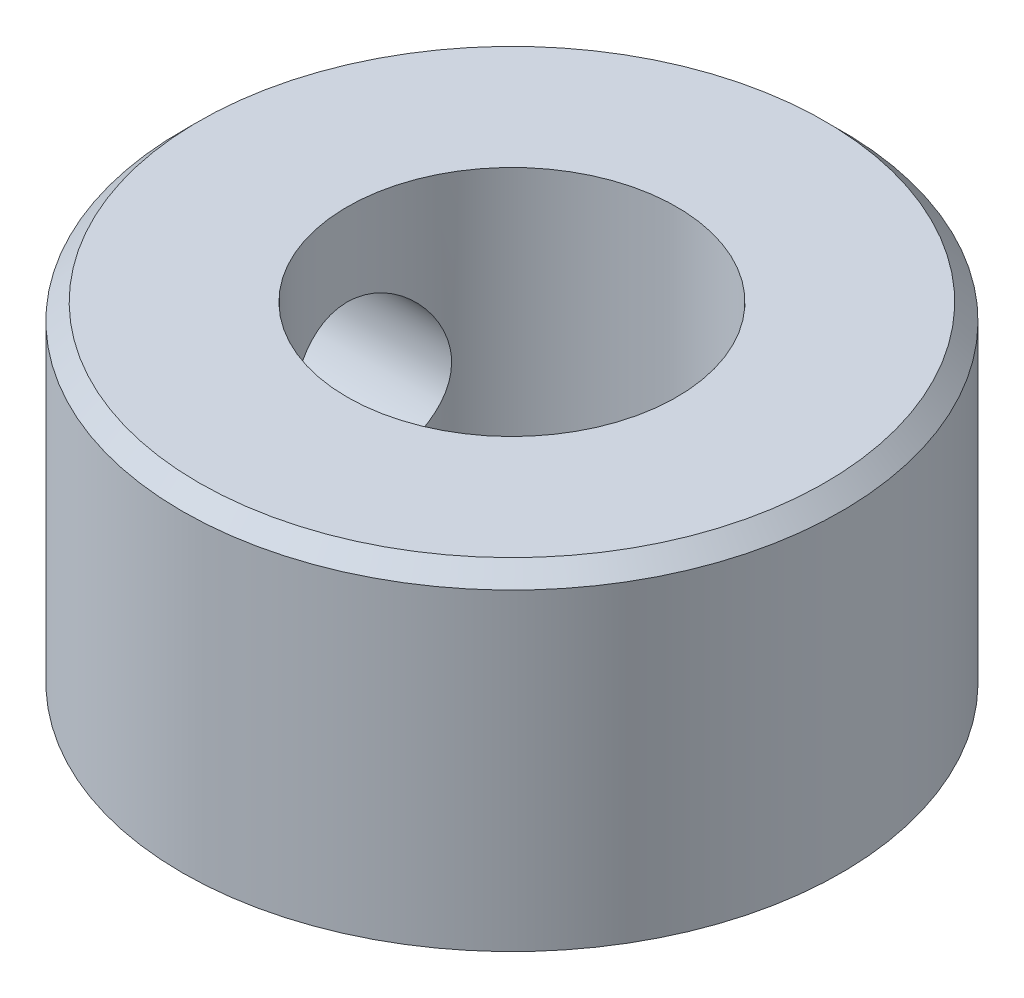
ISO-10303-21;
HEADER;
FILE_DESCRIPTION(('STEP AP214'),'2;1');
FILE_NAME('part.step','',(''),(''),'','','');
FILE_SCHEMA(('AUTOMOTIVE_DESIGN { 1 0 10303 214 1 1 1 1 }'));
ENDSEC;
DATA;
#1=APPLICATION_CONTEXT('core data for automotive mechanical design processes');
#2=APPLICATION_PROTOCOL_DEFINITION('international standard','automotive_design',2000,#1);
#3=PRODUCT_CONTEXT('',#1,'mechanical');
#4=PRODUCT('Part','Part','',(#3));
#5=PRODUCT_RELATED_PRODUCT_CATEGORY('part','',(#4));
#6=PRODUCT_DEFINITION_FORMATION('','',#4);
#7=PRODUCT_DEFINITION_CONTEXT('part definition',#1,'design');
#8=PRODUCT_DEFINITION('design','',#6,#7);
#9=PRODUCT_DEFINITION_SHAPE('','',#8);
#10=(LENGTH_UNIT() NAMED_UNIT(*) SI_UNIT(.MILLI.,.METRE.));
#11=(NAMED_UNIT(*) PLANE_ANGLE_UNIT() SI_UNIT($,.RADIAN.));
#12=(NAMED_UNIT(*) SI_UNIT($,.STERADIAN.) SOLID_ANGLE_UNIT());
#13=UNCERTAINTY_MEASURE_WITH_UNIT(LENGTH_MEASURE(1.E-05),#10,'distance_accuracy_value','');
#14=(GEOMETRIC_REPRESENTATION_CONTEXT(3) GLOBAL_UNCERTAINTY_ASSIGNED_CONTEXT((#13)) GLOBAL_UNIT_ASSIGNED_CONTEXT((#10,
#11,#12)) REPRESENTATION_CONTEXT('',''));
#15=CARTESIAN_POINT('',(0.,0.,0.));
#16=DIRECTION('',(0.,0.,1.));
#17=DIRECTION('',(1.,0.,0.));
#18=AXIS2_PLACEMENT_3D('',#15,#16,#17);
#19=CARTESIAN_POINT('',(0.,10.,0.));
#20=DIRECTION('',(0.,1.,0.));
#21=DIRECTION('',(0.,0.,1.));
#22=AXIS2_PLACEMENT_3D('',#19,#20,#21);
#23=PLANE('',#22);
#24=CARTESIAN_POINT('',(0.,10.,0.));
#25=DIRECTION('',(0.,1.,0.));
#26=DIRECTION('',(0.,0.,1.));
#27=AXIS2_PLACEMENT_3D('',#24,#25,#26);
#28=CIRCLE('',#27,9.49999999999999);
#29=CARTESIAN_POINT('',(0.,10.,9.49999999999999));
#30=VERTEX_POINT('',#29);
#31=EDGE_CURVE('E41',#30,#30,#28,.T.);
#32=ORIENTED_EDGE('',*,*,#31,.T.);
#33=EDGE_LOOP('',(#32));
#34=FACE_BOUND('',#33,.T.);
#35=CARTESIAN_POINT('',(0.,10.,0.));
#36=DIRECTION('',(0.,1.,0.));
#37=DIRECTION('',(0.,0.,1.));
#38=AXIS2_PLACEMENT_3D('',#35,#36,#37);
#39=CIRCLE('',#38,5.);
#40=CARTESIAN_POINT('',(0.,10.,5.));
#41=VERTEX_POINT('',#40);
#42=EDGE_CURVE('E49',#41,#41,#39,.T.);
#43=ORIENTED_EDGE('',*,*,#42,.F.);
#44=EDGE_LOOP('',(#43));
#45=FACE_BOUND('',#44,.T.);
#46=ADVANCED_FACE('F34',(#34,#45),#23,.T.);
#47=CARTESIAN_POINT('',(0.,0.,0.));
#48=DIRECTION('',(0.,1.,0.));
#49=DIRECTION('',(0.,0.,1.));
#50=AXIS2_PLACEMENT_3D('',#47,#48,#49);
#51=PLANE('',#50);
#52=CARTESIAN_POINT('',(0.,0.,0.));
#53=DIRECTION('',(0.,1.,0.));
#54=DIRECTION('',(0.,0.,1.));
#55=AXIS2_PLACEMENT_3D('',#52,#53,#54);
#56=CIRCLE('',#55,10.);
#57=CARTESIAN_POINT('',(0.,0.,10.));
#58=VERTEX_POINT('',#57);
#59=EDGE_CURVE('E45',#58,#58,#56,.T.);
#60=ORIENTED_EDGE('',*,*,#59,.F.);
#61=EDGE_LOOP('',(#60));
#62=FACE_BOUND('',#61,.T.);
#63=CARTESIAN_POINT('',(0.,0.,0.));
#64=DIRECTION('',(0.,1.,0.));
#65=DIRECTION('',(0.,0.,1.));
#66=AXIS2_PLACEMENT_3D('',#63,#64,#65);
#67=CIRCLE('',#66,5.);
#68=CARTESIAN_POINT('',(0.,0.,5.));
#69=VERTEX_POINT('',#68);
#70=EDGE_CURVE('E52',#69,#69,#67,.T.);
#71=ORIENTED_EDGE('',*,*,#70,.T.);
#72=EDGE_LOOP('',(#71));
#73=FACE_BOUND('',#72,.T.);
#74=ADVANCED_FACE('F85',(#62,#73),#51,.F.);
#75=CARTESIAN_POINT('',(0.,10.,0.));
#76=DIRECTION('',(0.,-1.,0.));
#77=DIRECTION('',(0.,0.,-1.));
#78=AXIS2_PLACEMENT_3D('',#75,#76,#77);
#79=CYLINDRICAL_SURFACE('',#78,10.);
#80=CARTESIAN_POINT('',(-9.68245836551854,5.,-2.5));
#81=CARTESIAN_POINT('',(-9.6824610008786,4.86194924907342,-2.49999607859307));
#82=CARTESIAN_POINT('',(-9.68544306014597,4.72385510132148,-2.48852624549765));
#83=CARTESIAN_POINT('',(-9.69701861992564,4.45163242182649,-2.44302312546379));
#84=CARTESIAN_POINT('',(-9.7056153862163,4.31750624553181,-2.40897670674211));
#85=CARTESIAN_POINT('',(-9.7273872459615,4.05719646181282,-2.31949119963204));
#86=CARTESIAN_POINT('',(-9.74055642690458,3.93100284461429,-2.26407972785449));
#87=CARTESIAN_POINT('',(-9.76998192028759,3.68968914746012,-2.13352114126138));
#88=CARTESIAN_POINT('',(-9.78623836378489,3.57456953791978,-2.05837318856068));
#89=CARTESIAN_POINT('',(-9.82040716355625,3.35613835473778,-1.88870842731188));
#90=CARTESIAN_POINT('',(-9.83834597623034,3.25310639964995,-1.79383688770405));
#91=CARTESIAN_POINT('',(-9.87362875515294,3.06423860563966,-1.58818206410066));
#92=CARTESIAN_POINT('',(-9.89097266566388,2.97840437437825,-1.47739729418031));
#93=CARTESIAN_POINT('',(-9.92340415520582,2.82522453236872,-1.24114520107895));
#94=CARTESIAN_POINT('',(-9.93845687400592,2.75815361183853,-1.11549457619512));
#95=CARTESIAN_POINT('',(-9.96430811925984,2.64619035584692,-0.854263184292761));
#96=CARTESIAN_POINT('',(-9.97510727334345,2.60129474808448,-0.718683885791939));
#97=CARTESIAN_POINT('',(-9.9910475884818,2.53585216542141,-0.44435875875416));
#98=CARTESIAN_POINT('',(-9.99629893844314,2.51483035567342,-0.305732719548974));
#99=CARTESIAN_POINT('',(-10.000935941073,2.49624162072445,-0.026828819262768));
#100=CARTESIAN_POINT('',(-10.000322460967,2.4986712277904,0.11344879453807));
#101=CARTESIAN_POINT('',(-9.99338094953534,2.52657485025014,0.388380617930969));
#102=CARTESIAN_POINT('',(-9.98718002340871,2.55153632505386,0.523090539002669));
#103=CARTESIAN_POINT('',(-9.96990836524857,2.6229712700485,0.786345618534217));
#104=CARTESIAN_POINT('',(-9.95883737398452,2.66944588537741,0.914890448426096));
#105=CARTESIAN_POINT('',(-9.93287509700884,2.78300257068706,1.16351675875452));
#106=CARTESIAN_POINT('',(-9.91795019695011,2.85026704466175,1.28351127441626));
#107=CARTESIAN_POINT('',(-9.88589903809692,3.00335567911626,1.51068905585122));
#108=CARTESIAN_POINT('',(-9.8687723965265,3.08918306856063,1.61787008771377));
#109=CARTESIAN_POINT('',(-9.83363713769356,3.27970874198237,1.81943508771239));
#110=CARTESIAN_POINT('',(-9.81561719525297,3.38485489234775,1.91339419768799));
#111=CARTESIAN_POINT('',(-9.78115043517327,3.60959997354028,2.08244093990755));
#112=CARTESIAN_POINT('',(-9.76470369108289,3.7291995794911,2.15752769011507));
#113=CARTESIAN_POINT('',(-9.73520496829319,3.98029003414886,2.28697032255647));
#114=CARTESIAN_POINT('',(-9.72216983717007,4.1118357303128,2.34122391742613));
#115=CARTESIAN_POINT('',(-9.70118640148669,4.38258546807684,2.42671405159096));
#116=CARTESIAN_POINT('',(-9.69323700842733,4.5217878639846,2.45795551638266));
#117=CARTESIAN_POINT('',(-9.68355356007457,4.79995950152992,2.49582963866592));
#118=CARTESIAN_POINT('',(-9.68166088976933,4.93883779334103,2.50309047391912));
#119=CARTESIAN_POINT('',(-9.68387343364692,5.21582193658526,2.49451699051516));
#120=CARTESIAN_POINT('',(-9.687978095703,5.35392785794944,2.4786847978498));
#121=CARTESIAN_POINT('',(-9.70157081984979,5.62311426494857,2.42492546393825));
#122=CARTESIAN_POINT('',(-9.71096970242531,5.7542727265692,2.3873640682819));
#123=CARTESIAN_POINT('',(-9.73400718262805,6.00843145785333,2.29161808167046));
#124=CARTESIAN_POINT('',(-9.74764628246408,6.13143075905578,2.2334310477125));
#125=CARTESIAN_POINT('',(-9.77796137095511,6.3684412778669,2.0967706679366));
#126=CARTESIAN_POINT('',(-9.79469168607245,6.48222884004298,2.01792175383564));
#127=CARTESIAN_POINT('',(-9.82917083071113,6.69518836280148,1.84265073233613));
#128=CARTESIAN_POINT('',(-9.84691982728307,6.79435791665011,1.7462257370136));
#129=CARTESIAN_POINT('',(-9.88197403031774,6.97781104257092,1.53565680246182));
#130=CARTESIAN_POINT('',(-9.8992570206188,7.0616600625488,1.42112988132898));
#131=CARTESIAN_POINT('',(-9.93097216613689,7.20893586695125,1.17925670673669));
#132=CARTESIAN_POINT('',(-9.94540447003949,7.27236371660821,1.05191112239398));
#133=CARTESIAN_POINT('',(-9.96970115738325,7.37644603452793,0.788895504327726));
#134=CARTESIAN_POINT('',(-9.97959830022409,7.41726428437907,0.653293452569705));
#135=CARTESIAN_POINT('',(-9.99385293395789,7.47546033460842,0.376874400797016));
#136=CARTESIAN_POINT('',(-9.99821149393422,7.49284265873904,0.236058412603101));
#137=CARTESIAN_POINT('',(-10.0008542352202,7.50341897393885,-0.042708816108308));
#138=CARTESIAN_POINT('',(-9.99929947199971,7.49725427273852,-0.180634567415054));
#139=CARTESIAN_POINT('',(-9.99064741143608,7.46238043176413,-0.453418741036877));
#140=CARTESIAN_POINT('',(-9.98355027892922,7.43367196246708,-0.588277254452321));
#141=CARTESIAN_POINT('',(-9.96463582134723,7.35486945057285,-0.850427589111936));
#142=CARTESIAN_POINT('',(-9.95284411255981,7.30489136671405,-0.977756236452159));
#143=CARTESIAN_POINT('',(-9.92578222284145,7.18507355245107,-1.22229263260406));
#144=CARTESIAN_POINT('',(-9.91051160346894,7.11523131832379,-1.33949910316408));
#145=CARTESIAN_POINT('',(-9.87768124200718,6.95571191500967,-1.56350482105826));
#146=CARTESIAN_POINT('',(-9.86007542354161,6.86559964274043,-1.66998747074584));
#147=CARTESIAN_POINT('',(-9.82476622642974,6.66894287005663,-1.86653755068376));
#148=CARTESIAN_POINT('',(-9.80706282418256,6.56239420972209,-1.95660081269148));
#149=CARTESIAN_POINT('',(-9.77318689613756,6.33349646452635,-2.11940506617958));
#150=CARTESIAN_POINT('',(-9.75704909183222,6.21088969158686,-2.19179154854095));
#151=CARTESIAN_POINT('',(-9.7285988873707,5.95486127531295,-2.31481724146367));
#152=CARTESIAN_POINT('',(-9.71628370583034,5.82144758476538,-2.36547227438038));
#153=CARTESIAN_POINT('',(-9.69879771876843,5.5735574704121,-2.43605632142751));
#154=CARTESIAN_POINT('',(-9.69271657508747,5.46026708903466,-2.4599829264922));
#155=CARTESIAN_POINT('',(-9.6845459645655,5.23132782750578,-2.49195573142942));
#156=CARTESIAN_POINT('',(-9.68245615722769,5.11567914938899,-2.50000328592938));
#157=CARTESIAN_POINT('',(-9.68245836551854,5.,-2.5));
#158=B_SPLINE_CURVE_WITH_KNOTS('',3,(#80,#81,#82,#83,#84,#85,#86,#87,#88,#89,#90,#91,#92,#93,
#94,#95,#96,#97,#98,#99,#100,#101,#102,#103,#104,#105,#106,#107,#108,#109,#110,#111,#112,#113,
#114,#115,#116,#117,#118,#119,#120,#121,#122,#123,#124,#125,#126,#127,#128,#129,#130,#131,#132,
#133,#134,#135,#136,#137,#138,#139,#140,#141,#142,#143,#144,#145,#146,#147,#148,#149,#150,#151,
#152,#153,#154,#155,#156,#157),.UNSPECIFIED.,.T.,.F.,(4,2,2,2,2,2,2,2,2,2,2,2,2,2,2,2,2,2,2,2,2,
2,2,2,2,2,2,2,2,2,2,2,2,2,2,2,2,2,4),(0.,0.413727441736137,0.827695741428667,1.24113072716602,
1.65458326755479,2.07623954192976,2.49793521479867,2.9255149639792,3.35303159847093,
3.77188750995347,4.19068148666021,4.60018262688947,5.00970556724786,5.42292874254445,
5.83622385468914,6.26070466571912,6.68520531199802,7.11176432008403,7.53823200129548,
7.95343574764205,8.36860127188747,8.77697405014152,9.18539521426363,9.60182845864103,
10.0183301888999,10.4452533097026,10.872154157245,11.2959207281187,11.7196054891398,
12.131834461324,12.5440511738193,12.9540487656466,13.3640980574302,13.7839709658702,
14.2039503157045,14.6317647729113,15.0592672137502,15.4059782718573,15.7526597510792),.UNSPECIFIED.);
#159=CARTESIAN_POINT('',(-9.68245836551854,5.,-2.5));
#160=VERTEX_POINT('',#159);
#161=EDGE_CURVE('E55',#160,#160,#158,.T.);
#162=ORIENTED_EDGE('',*,*,#161,.F.);
#163=EDGE_LOOP('',(#162));
#164=FACE_BOUND('',#163,.T.);
#165=CARTESIAN_POINT('',(0.,9.5,0.));
#166=DIRECTION('',(0.,1.,0.));
#167=DIRECTION('',(0.,0.,1.));
#168=AXIS2_PLACEMENT_3D('',#165,#166,#167);
#169=CIRCLE('',#168,10.);
#170=CARTESIAN_POINT('',(0.,9.5,10.));
#171=VERTEX_POINT('',#170);
#172=EDGE_CURVE('E10',#171,#171,#169,.F.);
#173=ORIENTED_EDGE('',*,*,#172,.T.);
#174=EDGE_LOOP('',(#173));
#175=FACE_BOUND('',#174,.T.);
#176=ORIENTED_EDGE('',*,*,#59,.T.);
#177=EDGE_LOOP('',(#176));
#178=FACE_BOUND('',#177,.T.);
#179=ADVANCED_FACE('F81',(#164,#175,#178),#79,.T.);
#180=CARTESIAN_POINT('',(0.,10.,0.));
#181=DIRECTION('',(0.,-1.,0.));
#182=DIRECTION('',(0.,0.,-1.));
#183=AXIS2_PLACEMENT_3D('',#180,#181,#182);
#184=CYLINDRICAL_SURFACE('',#183,5.);
#185=CARTESIAN_POINT('',(-4.33012701892219,5.,-2.5));
#186=CARTESIAN_POINT('',(-4.33013982272992,4.86973349312351,-2.49998948436432));
#187=CARTESIAN_POINT('',(-4.33609541965583,4.73929727932375,-2.48974954513168));
#188=CARTESIAN_POINT('',(-4.35905877051907,4.48243102847077,-2.44930840724944));
#189=CARTESIAN_POINT('',(-4.37608974726023,4.35600999594271,-2.41906526369545));
#190=CARTESIAN_POINT('',(-4.41873376871659,4.11137105443893,-2.3402497699757));
#191=CARTESIAN_POINT('',(-4.44430111338921,3.99311342643779,-2.29177485369963));
#192=CARTESIAN_POINT('',(-4.50106659111455,3.76643943690545,-2.17816884056414));
#193=CARTESIAN_POINT('',(-4.53226502875883,3.65802360820421,-2.11303684262671));
#194=CARTESIAN_POINT('',(-4.59992173524851,3.44423569608308,-1.96166634317253));
#195=CARTESIAN_POINT('',(-4.63660159331577,3.33985216551023,-1.87413008816917));
#196=CARTESIAN_POINT('',(-4.70929956727453,3.1464790242868,-1.68313452122752));
#197=CARTESIAN_POINT('',(-4.74531734512768,3.05749709224505,-1.57966731506051));
#198=CARTESIAN_POINT('',(-4.81553692452135,2.89158212351436,-1.35122390789082));
#199=CARTESIAN_POINT('',(-4.84945266064072,2.81586558072086,-1.22526797235894));
#200=CARTESIAN_POINT('',(-4.90876890230193,2.68714786651614,-0.960392566671146));
#201=CARTESIAN_POINT('',(-4.93417477954535,2.6341323595615,-0.821481345389982));
#202=CARTESIAN_POINT('',(-4.9720115311507,2.55623834683603,-0.545112359773522));
#203=CARTESIAN_POINT('',(-4.98523700553425,2.52962618413487,-0.408254476210982));
#204=CARTESIAN_POINT('',(-5.00018959613973,2.49958470328871,-0.131426571755676));
#205=CARTESIAN_POINT('',(-5.00192366961168,2.49614135800464,0.00854151460650908));
#206=CARTESIAN_POINT('',(-4.99407454791405,2.51186668493142,0.274581311061965));
#207=CARTESIAN_POINT('',(-4.98546239730476,2.52909503880454,0.400802997942673));
#208=CARTESIAN_POINT('',(-4.95935613149294,2.58220210976015,0.64828442979511));
#209=CARTESIAN_POINT('',(-4.94186135165964,2.61808222244015,0.769543802734626));
#210=CARTESIAN_POINT('',(-4.89928958219156,2.70770641522494,1.00577347892407));
#211=CARTESIAN_POINT('',(-4.87411103823003,2.76169078293028,1.120633558788));
#212=CARTESIAN_POINT('',(-4.81844114966712,2.88565854050362,1.33994200378327));
#213=CARTESIAN_POINT('',(-4.78794790393709,2.95564765825584,1.4443866220966));
#214=CARTESIAN_POINT('',(-4.72110985998075,3.11723837883257,1.6504341522455));
#215=CARTESIAN_POINT('',(-4.68448439995438,3.21025757081503,1.75083518757341));
#216=CARTESIAN_POINT('',(-4.61135851467029,3.41147431232543,1.93526092574445));
#217=CARTESIAN_POINT('',(-4.57485820664072,3.51968343068515,2.01927302893558));
#218=CARTESIAN_POINT('',(-4.50360390231212,3.75662048106022,2.17376333660553));
#219=CARTESIAN_POINT('',(-4.46910799976769,3.88621505763553,2.24304328744513));
#220=CARTESIAN_POINT('',(-4.4093862569644,4.15734417839749,2.35829778250308));
#221=CARTESIAN_POINT('',(-4.38415075115168,4.29886608254391,2.40429664552722));
#222=CARTESIAN_POINT('',(-4.34861589542586,4.57803627820697,2.4679505275626));
#223=CARTESIAN_POINT('',(-4.33729139621241,4.71510279760887,2.48756280529994));
#224=CARTESIAN_POINT('',(-4.32794798404024,4.99100335379136,2.50379236652857));
#225=CARTESIAN_POINT('',(-4.32991967223279,5.1298360727995,2.50042589328757));
#226=CARTESIAN_POINT('',(-4.34585841351462,5.3891347964468,2.47259010835991));
#227=CARTESIAN_POINT('',(-4.35848968766635,5.50994862776973,2.45046954178116));
#228=CARTESIAN_POINT('',(-4.39235053878353,5.74591946567748,2.38924071158112));
#229=CARTESIAN_POINT('',(-4.41358290012585,5.86107462686685,2.35012694655908));
#230=CARTESIAN_POINT('',(-4.46340555199141,6.08852832725639,2.25411897151217));
#231=CARTESIAN_POINT('',(-4.49229108107657,6.20044754213256,2.19648515923163));
#232=CARTESIAN_POINT('',(-4.55390298743125,6.4136731788488,2.0657176600397));
#233=CARTESIAN_POINT('',(-4.58663133387872,6.51497410878814,1.99257601083123));
#234=CARTESIAN_POINT('',(-4.65719996140836,6.71744691880332,1.82209291799636));
#235=CARTESIAN_POINT('',(-4.69516457885708,6.81699287677222,1.72286318078435));
#236=CARTESIAN_POINT('',(-4.76835587444746,6.99853059500591,1.5085112384988));
#237=CARTESIAN_POINT('',(-4.80358162519329,7.08051642565855,1.39338368664988));
#238=CARTESIAN_POINT('',(-4.86853404227334,7.22643431479089,1.14633840638507));
#239=CARTESIAN_POINT('',(-4.89809104179855,7.28983279520846,1.01405774389062));
#240=CARTESIAN_POINT('',(-4.9470838739847,7.39284475996202,0.738805911647331));
#241=CARTESIAN_POINT('',(-4.96652859191746,7.43247912960512,0.595844253647066));
#242=CARTESIAN_POINT('',(-4.99168770453968,7.48342140935642,0.317449205674705));
#243=CARTESIAN_POINT('',(-4.99849819767838,7.49699468583035,0.182528609085376));
#244=CARTESIAN_POINT('',(-5.00105325940467,7.50210816749459,-0.0878149643374312));
#245=CARTESIAN_POINT('',(-4.99680170177042,7.49365608566109,-0.223237748727017));
#246=CARTESIAN_POINT('',(-4.97834922085637,7.45645896960449,-0.481344982671074));
#247=CARTESIAN_POINT('',(-4.96482236636807,7.42908782836369,-0.604280801321774));
#248=CARTESIAN_POINT('',(-4.92980234191731,7.35668255024167,-0.843614873664456));
#249=CARTESIAN_POINT('',(-4.90830802955518,7.31164588036637,-0.960012187087214));
#250=CARTESIAN_POINT('',(-4.85814826741488,7.20318218126074,-1.18855854199593));
#251=CARTESIAN_POINT('',(-4.82921542506803,7.13905097531016,-1.30031295715363));
#252=CARTESIAN_POINT('',(-4.76720333344986,6.99510588985241,-1.51193650408535));
#253=CARTESIAN_POINT('',(-4.73412218229104,6.91528480737313,-1.61180014305397));
#254=CARTESIAN_POINT('',(-4.66321523550925,6.73300420555064,-1.8072854232437));
#255=CARTESIAN_POINT('',(-4.62524489658367,6.62908227399927,-1.90149582349003));
#256=CARTESIAN_POINT('',(-4.55157698284941,6.40638471461777,-2.07165660492503));
#257=CARTESIAN_POINT('',(-4.51588143910584,6.28759608580077,-2.1475908315154));
#258=CARTESIAN_POINT('',(-4.44998982823926,6.03336388233574,-2.28108393396029));
#259=CARTESIAN_POINT('',(-4.42000320346984,5.8975126115754,-2.3379862797745));
#260=CARTESIAN_POINT('',(-4.38370272660093,5.68677735048023,-2.40494911880459));
#261=CARTESIAN_POINT('',(-4.37305486646054,5.61544022430239,-2.42419582683991));
#262=CARTESIAN_POINT('',(-4.35507574170935,5.47095930315067,-2.45635087255789));
#263=CARTESIAN_POINT('',(-4.34774215854234,5.39781680904558,-2.46926364179176));
#264=CARTESIAN_POINT('',(-4.3382377954292,5.27049901345306,-2.48591166201423));
#265=CARTESIAN_POINT('',(-4.33520487024791,5.21658367848779,-2.49118864979202));
#266=CARTESIAN_POINT('',(-4.33114674911323,5.10845538368959,-2.49823512543934));
#267=CARTESIAN_POINT('',(-4.33012168747261,5.05424240418945,-2.50000437866475));
#268=CARTESIAN_POINT('',(-4.33012701892219,5.,-2.5));
#269=B_SPLINE_CURVE_WITH_KNOTS('',3,(#185,#186,#187,#188,#189,#190,#191,#192,#193,#194,#195,
#196,#197,#198,#199,#200,#201,#202,#203,#204,#205,#206,#207,#208,#209,#210,#211,#212,#213,#214,
#215,#216,#217,#218,#219,#220,#221,#222,#223,#224,#225,#226,#227,#228,#229,#230,#231,#232,#233,
#234,#235,#236,#237,#238,#239,#240,#241,#242,#243,#244,#245,#246,#247,#248,#249,#250,#251,#252,
#253,#254,#255,#256,#257,#258,#259,#260,#261,#262,#263,#264,#265,#266,#267,#268),.UNSPECIFIED.,
.T.,.F.,(4,2,2,2,2,2,2,2,2,2,2,2,2,2,2,2,2,2,2,2,2,2,2,2,2,2,2,2,2,2,2,2,2,2,2,2,2,2,2,2,2,4),
(0.,0.390580306486788,0.781982232062012,1.17132148982692,1.56068181366371,1.98215578129642,
2.40383927716011,2.85394730601992,3.30377067414811,3.72158712424921,4.13915059220183,
4.52040243716429,4.90168281298721,5.2882383683295,5.67493248380763,6.0981797864731,
6.5217512061988,6.97222104328704,7.42221935534346,7.83655727140613,8.25060232976016,
8.61935458565148,8.98822631095241,9.37418241020303,9.76033715555202,10.1951685895662,
10.6301466245059,11.076604535375,11.5226694952701,11.927806759788,12.3328021699001,
12.7111106218382,13.0894733378512,13.4840187680376,13.8787457525688,14.3127560463025,
14.7471485711797,15.195268726016,15.4189244153949,15.6424233996907,15.8050484542806,
15.9676843870379),.UNSPECIFIED.);
#270=CARTESIAN_POINT('',(-4.33012701892219,5.,-2.5));
#271=VERTEX_POINT('',#270);
#272=EDGE_CURVE('E65',#271,#271,#269,.T.);
#273=ORIENTED_EDGE('',*,*,#272,.T.);
#274=EDGE_LOOP('',(#273));
#275=FACE_BOUND('',#274,.T.);
#276=ORIENTED_EDGE('',*,*,#42,.T.);
#277=EDGE_LOOP('',(#276));
#278=FACE_BOUND('',#277,.T.);
#279=ORIENTED_EDGE('',*,*,#70,.F.);
#280=EDGE_LOOP('',(#279));
#281=FACE_BOUND('',#280,.T.);
#282=ADVANCED_FACE('F77',(#275,#278,#281),#184,.F.);
#283=CARTESIAN_POINT('',(0.,10.,0.));
#284=DIRECTION('',(0.,-1.,0.));
#285=DIRECTION('',(0.,0.,-1.));
#286=AXIS2_PLACEMENT_3D('',#283,#284,#285);
#287=CONICAL_SURFACE('',#286,9.49999999999999,0.78539816339745);
#288=ORIENTED_EDGE('',*,*,#172,.F.);
#289=EDGE_LOOP('',(#288));
#290=FACE_BOUND('',#289,.T.);
#291=ORIENTED_EDGE('',*,*,#31,.F.);
#292=EDGE_LOOP('',(#291));
#293=FACE_BOUND('',#292,.T.);
#294=ADVANCED_FACE('F36',(#290,#293),#287,.T.);
#295=CARTESIAN_POINT('',(-10.001,5.,0.));
#296=DIRECTION('',(1.,0.,0.));
#297=DIRECTION('',(0.,0.,-1.));
#298=AXIS2_PLACEMENT_3D('',#295,#296,#297);
#299=CYLINDRICAL_SURFACE('',#298,2.5);
#300=ORIENTED_EDGE('',*,*,#272,.F.);
#301=EDGE_LOOP('',(#300));
#302=FACE_BOUND('',#301,.T.);
#303=ORIENTED_EDGE('',*,*,#161,.T.);
#304=EDGE_LOOP('',(#303));
#305=FACE_BOUND('',#304,.T.);
#306=ADVANCED_FACE('F70',(#302,#305),#299,.F.);
#307=CLOSED_SHELL('',(#46,#74,#179,#282,#294,#306));
#308=MANIFOLD_SOLID_BREP('B2',#307);
#309=ADVANCED_BREP_SHAPE_REPRESENTATION('',(#18,#308),#14);
#310=SHAPE_DEFINITION_REPRESENTATION(#9,#309);
ENDSEC;
END-ISO-10303-21;
